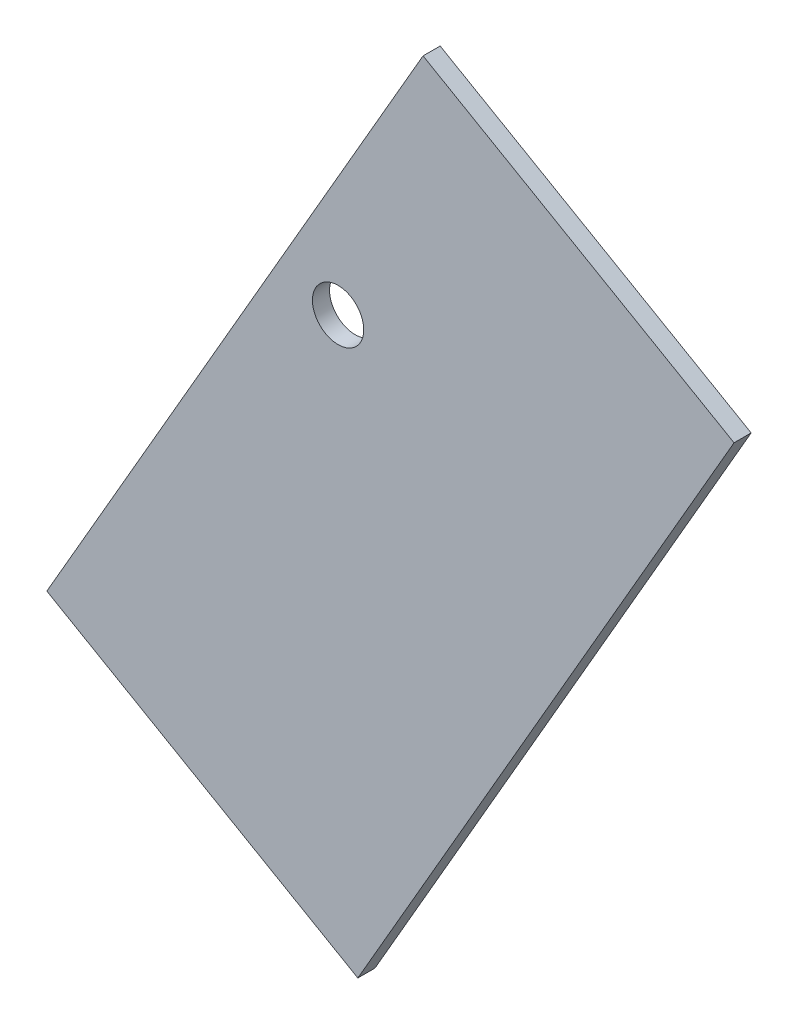
ISO-10303-21;
HEADER;
FILE_DESCRIPTION(('STEP AP214'),'2;1');
FILE_NAME('part.step','',(''),(''),'','','');
FILE_SCHEMA(('AUTOMOTIVE_DESIGN { 1 0 10303 214 1 1 1 1 }'));
ENDSEC;
DATA;
#1=APPLICATION_CONTEXT('core data for automotive mechanical design processes');
#2=APPLICATION_PROTOCOL_DEFINITION('international standard','automotive_design',2000,#1);
#3=PRODUCT_CONTEXT('',#1,'mechanical');
#4=PRODUCT('Part','Part','',(#3));
#5=PRODUCT_RELATED_PRODUCT_CATEGORY('part','',(#4));
#6=PRODUCT_DEFINITION_FORMATION('','',#4);
#7=PRODUCT_DEFINITION_CONTEXT('part definition',#1,'design');
#8=PRODUCT_DEFINITION('design','',#6,#7);
#9=PRODUCT_DEFINITION_SHAPE('','',#8);
#10=(LENGTH_UNIT() NAMED_UNIT(*) SI_UNIT(.MILLI.,.METRE.));
#11=(NAMED_UNIT(*) PLANE_ANGLE_UNIT() SI_UNIT($,.RADIAN.));
#12=(NAMED_UNIT(*) SI_UNIT($,.STERADIAN.) SOLID_ANGLE_UNIT());
#13=UNCERTAINTY_MEASURE_WITH_UNIT(LENGTH_MEASURE(1.E-05),#10,'distance_accuracy_value','');
#14=(GEOMETRIC_REPRESENTATION_CONTEXT(3) GLOBAL_UNCERTAINTY_ASSIGNED_CONTEXT((#13)) GLOBAL_UNIT_ASSIGNED_CONTEXT((#10,
#11,#12)) REPRESENTATION_CONTEXT('',''));
#15=CARTESIAN_POINT('',(0.,0.,0.));
#16=DIRECTION('',(0.,0.,1.));
#17=DIRECTION('',(1.,0.,0.));
#18=AXIS2_PLACEMENT_3D('',#15,#16,#17);
#19=CARTESIAN_POINT('',(48.0644099100623,639.582012286204,-381.357743681072));
#20=DIRECTION('',(0.,0.,1.));
#21=DIRECTION('',(1.,0.,0.));
#22=AXIS2_PLACEMENT_3D('',#19,#20,#21);
#23=PLANE('',#22);
#24=CARTESIAN_POINT('',(45.002232083571,648.278164708908,-381.357743681072));
#25=DIRECTION('',(0.,0.,-1.));
#26=DIRECTION('',(0.,1.,0.));
#27=AXIS2_PLACEMENT_3D('',#24,#25,#26);
#28=CIRCLE('',#27,1.5);
#29=CARTESIAN_POINT('',(45.002232083571,649.778164708908,-381.357743681072));
#30=VERTEX_POINT('',#29);
#31=EDGE_CURVE('E20',#30,#30,#28,.T.);
#32=ORIENTED_EDGE('',*,*,#31,.T.);
#33=EDGE_LOOP('',(#32));
#34=FACE_BOUND('',#33,.T.);
#35=DIRECTION('',(-0.866025403784449,0.499999999999982,0.));
#36=VECTOR('',#35,1.);
#37=CARTESIAN_POINT('',(49.9711431703231,663.884571169459,-381.357743681072));
#38=LINE('',#37,#36);
#39=CARTESIAN_POINT('',(49.9711431703232,663.884571169459,-381.357743681072));
#40=VERTEX_POINT('',#39);
#41=CARTESIAN_POINT('',(68.1576766497966,653.384571169459,-381.357743681072));
#42=VERTEX_POINT('',#41);
#43=EDGE_CURVE('E67',#40,#42,#38,.F.);
#44=ORIENTED_EDGE('',*,*,#43,.F.);
#45=DIRECTION('',(-0.500000000000005,-0.866025403784436,0.));
#46=VECTOR('',#45,1.);
#47=CARTESIAN_POINT('',(27.971143170329,625.779453402954,-381.357743681072));
#48=LINE('',#47,#46);
#49=CARTESIAN_POINT('',(27.9711431703291,625.779453402954,-381.357743681072));
#50=VERTEX_POINT('',#49);
#51=EDGE_CURVE('E58',#50,#40,#48,.F.);
#52=ORIENTED_EDGE('',*,*,#51,.F.);
#53=DIRECTION('',(0.866025403784178,-0.500000000000451,0.));
#54=VECTOR('',#53,1.);
#55=CARTESIAN_POINT('',(46.1576766497969,615.279453402945,-381.357743681072));
#56=LINE('',#55,#54);
#57=CARTESIAN_POINT('',(46.1576766497969,615.279453402945,-381.357743681072));
#58=VERTEX_POINT('',#57);
#59=EDGE_CURVE('E53',#58,#50,#56,.F.);
#60=ORIENTED_EDGE('',*,*,#59,.F.);
#61=DIRECTION('',(0.500000000000005,0.866025403784436,0.));
#62=VECTOR('',#61,1.);
#63=CARTESIAN_POINT('',(68.1576766497965,653.384571169459,-381.357743681072));
#64=LINE('',#63,#62);
#65=EDGE_CURVE('E70',#42,#58,#64,.F.);
#66=ORIENTED_EDGE('',*,*,#65,.F.);
#67=EDGE_LOOP('',(#44,#52,#60,#66));
#68=FACE_BOUND('',#67,.T.);
#69=ADVANCED_FACE('F17',(#34,#68),#23,.T.);
#70=CARTESIAN_POINT('',(49.9711431703231,663.884571169459,-382.357743681073));
#71=DIRECTION('',(0.499999999999982,0.866025403784449,0.));
#72=DIRECTION('',(-0.866025403784449,0.499999999999982,0.));
#73=AXIS2_PLACEMENT_3D('',#70,#71,#72);
#74=PLANE('',#73);
#75=DIRECTION('',(-0.866025403784439,0.499999999999999,0.));
#76=VECTOR('',#75,1.);
#77=CARTESIAN_POINT('',(68.1576766497965,653.384571169459,-382.357743681072));
#78=LINE('',#77,#76);
#79=CARTESIAN_POINT('',(68.1576766497966,653.384571169459,-382.357743681073));
#80=VERTEX_POINT('',#79);
#81=CARTESIAN_POINT('',(49.9711431703232,663.884571169459,-382.357743681073));
#82=VERTEX_POINT('',#81);
#83=EDGE_CURVE('E77',#80,#82,#78,.T.);
#84=ORIENTED_EDGE('',*,*,#83,.T.);
#85=DIRECTION('',(0.,0.,1.));
#86=VECTOR('',#85,1.);
#87=CARTESIAN_POINT('',(49.9711431703233,663.884571169459,-382.357743681073));
#88=LINE('',#87,#86);
#89=EDGE_CURVE('E63',#40,#82,#88,.F.);
#90=ORIENTED_EDGE('',*,*,#89,.F.);
#91=ORIENTED_EDGE('',*,*,#43,.T.);
#92=DIRECTION('',(0.,0.,1.));
#93=VECTOR('',#92,1.);
#94=CARTESIAN_POINT('',(68.1576766497965,653.384571169459,-382.357743681073));
#95=LINE('',#94,#93);
#96=EDGE_CURVE('E84',#80,#42,#95,.T.);
#97=ORIENTED_EDGE('',*,*,#96,.F.);
#98=EDGE_LOOP('',(#84,#90,#91,#97));
#99=FACE_BOUND('',#98,.T.);
#100=ADVANCED_FACE('F76',(#99),#74,.T.);
#101=CARTESIAN_POINT('',(27.971143170329,625.779453402954,-382.357743681073));
#102=DIRECTION('',(-0.866025403784436,0.500000000000005,0.));
#103=DIRECTION('',(-0.500000000000005,-0.866025403784436,0.));
#104=AXIS2_PLACEMENT_3D('',#101,#102,#103);
#105=PLANE('',#104);
#106=DIRECTION('',(-0.5,-0.866025403784438,0.));
#107=VECTOR('',#106,1.);
#108=CARTESIAN_POINT('',(49.9711431703231,663.884571169459,-382.357743681072));
#109=LINE('',#108,#107);
#110=CARTESIAN_POINT('',(27.9711431703291,625.779453402954,-382.357743681073));
#111=VERTEX_POINT('',#110);
#112=EDGE_CURVE('E87',#82,#111,#109,.T.);
#113=ORIENTED_EDGE('',*,*,#112,.T.);
#114=DIRECTION('',(0.,0.,1.));
#115=VECTOR('',#114,1.);
#116=CARTESIAN_POINT('',(27.9711431703292,625.779453402954,-382.357743681073));
#117=LINE('',#116,#115);
#118=EDGE_CURVE('E65',#50,#111,#117,.F.);
#119=ORIENTED_EDGE('',*,*,#118,.F.);
#120=ORIENTED_EDGE('',*,*,#51,.T.);
#121=ORIENTED_EDGE('',*,*,#89,.T.);
#122=EDGE_LOOP('',(#113,#119,#120,#121));
#123=FACE_BOUND('',#122,.T.);
#124=ADVANCED_FACE('F61',(#123),#105,.T.);
#125=CARTESIAN_POINT('',(46.1576766497969,615.279453402945,-382.357743681073));
#126=DIRECTION('',(-0.500000000000451,-0.866025403784178,0.));
#127=DIRECTION('',(0.866025403784178,-0.500000000000451,0.));
#128=AXIS2_PLACEMENT_3D('',#125,#126,#127);
#129=PLANE('',#128);
#130=DIRECTION('',(0.866025403784189,-0.500000000000433,0.));
#131=VECTOR('',#130,1.);
#132=CARTESIAN_POINT('',(27.971143170329,625.779453402954,-382.357743681072));
#133=LINE('',#132,#131);
#134=CARTESIAN_POINT('',(46.1576766497969,615.279453402945,-382.357743681073));
#135=VERTEX_POINT('',#134);
#136=EDGE_CURVE('E89',#111,#135,#133,.T.);
#137=ORIENTED_EDGE('',*,*,#136,.T.);
#138=DIRECTION('',(0.,0.,1.));
#139=VECTOR('',#138,1.);
#140=CARTESIAN_POINT('',(46.1576766497969,615.279453402945,-382.357743681073));
#141=LINE('',#140,#139);
#142=EDGE_CURVE('E34',#58,#135,#141,.F.);
#143=ORIENTED_EDGE('',*,*,#142,.F.);
#144=ORIENTED_EDGE('',*,*,#59,.T.);
#145=ORIENTED_EDGE('',*,*,#118,.T.);
#146=EDGE_LOOP('',(#137,#143,#144,#145));
#147=FACE_BOUND('',#146,.T.);
#148=ADVANCED_FACE('F96',(#147),#129,.T.);
#149=CARTESIAN_POINT('',(68.1576766497965,653.384571169459,-382.357743681073));
#150=DIRECTION('',(0.866025403784436,-0.500000000000005,0.));
#151=DIRECTION('',(0.500000000000005,0.866025403784436,0.));
#152=AXIS2_PLACEMENT_3D('',#149,#150,#151);
#153=PLANE('',#152);
#154=DIRECTION('',(0.500000000000006,0.866025403784435,0.));
#155=VECTOR('',#154,1.);
#156=CARTESIAN_POINT('',(46.1576766497969,615.279453402945,-382.357743681072));
#157=LINE('',#156,#155);
#158=EDGE_CURVE('E26',#135,#80,#157,.T.);
#159=ORIENTED_EDGE('',*,*,#158,.T.);
#160=ORIENTED_EDGE('',*,*,#96,.T.);
#161=ORIENTED_EDGE('',*,*,#65,.T.);
#162=ORIENTED_EDGE('',*,*,#142,.T.);
#163=EDGE_LOOP('',(#159,#160,#161,#162));
#164=FACE_BOUND('',#163,.T.);
#165=ADVANCED_FACE('F92',(#164),#153,.T.);
#166=CARTESIAN_POINT('',(45.002232083571,648.278164708908,-381.857743681072));
#167=DIRECTION('',(0.,0.,-1.));
#168=DIRECTION('',(0.,1.,0.));
#169=AXIS2_PLACEMENT_3D('',#166,#167,#168);
#170=CYLINDRICAL_SURFACE('',#169,1.5);
#171=ORIENTED_EDGE('',*,*,#31,.F.);
#172=EDGE_LOOP('',(#171));
#173=FACE_BOUND('',#172,.T.);
#174=CARTESIAN_POINT('',(45.002232083571,648.278164708908,-382.357743681072));
#175=DIRECTION('',(0.,0.,-1.));
#176=DIRECTION('',(0.,1.,0.));
#177=AXIS2_PLACEMENT_3D('',#174,#175,#176);
#178=CIRCLE('',#177,1.5);
#179=CARTESIAN_POINT('',(45.002232083571,649.778164708908,-382.357743681072));
#180=VERTEX_POINT('',#179);
#181=EDGE_CURVE('E11',#180,#180,#178,.T.);
#182=ORIENTED_EDGE('',*,*,#181,.T.);
#183=EDGE_LOOP('',(#182));
#184=FACE_BOUND('',#183,.T.);
#185=ADVANCED_FACE('F104',(#173,#184),#170,.F.);
#186=CARTESIAN_POINT('',(48.0644099100623,639.582012286204,-382.357743681072));
#187=DIRECTION('',(0.,0.,1.));
#188=DIRECTION('',(1.,0.,0.));
#189=AXIS2_PLACEMENT_3D('',#186,#187,#188);
#190=PLANE('',#189);
#191=ORIENTED_EDGE('',*,*,#181,.F.);
#192=EDGE_LOOP('',(#191));
#193=FACE_BOUND('',#192,.T.);
#194=ORIENTED_EDGE('',*,*,#136,.F.);
#195=ORIENTED_EDGE('',*,*,#112,.F.);
#196=ORIENTED_EDGE('',*,*,#83,.F.);
#197=ORIENTED_EDGE('',*,*,#158,.F.);
#198=EDGE_LOOP('',(#194,#195,#196,#197));
#199=FACE_BOUND('',#198,.T.);
#200=ADVANCED_FACE('F95',(#193,#199),#190,.F.);
#201=CLOSED_SHELL('',(#69,#100,#124,#148,#165,#185,#200));
#202=MANIFOLD_SOLID_BREP('B1',#201);
#203=ADVANCED_BREP_SHAPE_REPRESENTATION('',(#18,#202),#14);
#204=SHAPE_DEFINITION_REPRESENTATION(#9,#203);
ENDSEC;
END-ISO-10303-21;
